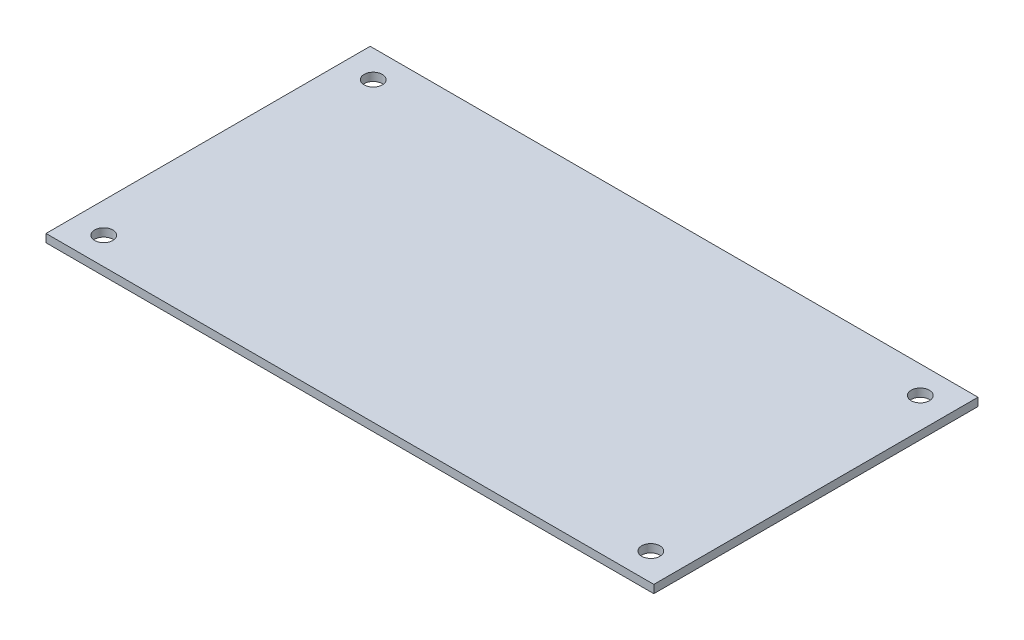
ISO-10303-21;
HEADER;
FILE_DESCRIPTION(('STEP AP214'),'2;1');
FILE_NAME('part.step','',(''),(''),'','','');
FILE_SCHEMA(('AUTOMOTIVE_DESIGN { 1 0 10303 214 1 1 1 1 }'));
ENDSEC;
DATA;
#1=APPLICATION_CONTEXT('core data for automotive mechanical design processes');
#2=APPLICATION_PROTOCOL_DEFINITION('international standard','automotive_design',2000,#1);
#3=PRODUCT_CONTEXT('',#1,'mechanical');
#4=PRODUCT('Part','Part','',(#3));
#5=PRODUCT_RELATED_PRODUCT_CATEGORY('part','',(#4));
#6=PRODUCT_DEFINITION_FORMATION('','',#4);
#7=PRODUCT_DEFINITION_CONTEXT('part definition',#1,'design');
#8=PRODUCT_DEFINITION('design','',#6,#7);
#9=PRODUCT_DEFINITION_SHAPE('','',#8);
#10=(LENGTH_UNIT() NAMED_UNIT(*) SI_UNIT(.MILLI.,.METRE.));
#11=(NAMED_UNIT(*) PLANE_ANGLE_UNIT() SI_UNIT($,.RADIAN.));
#12=(NAMED_UNIT(*) SI_UNIT($,.STERADIAN.) SOLID_ANGLE_UNIT());
#13=UNCERTAINTY_MEASURE_WITH_UNIT(LENGTH_MEASURE(1.E-05),#10,'distance_accuracy_value','');
#14=(GEOMETRIC_REPRESENTATION_CONTEXT(3) GLOBAL_UNCERTAINTY_ASSIGNED_CONTEXT((#13)) GLOBAL_UNIT_ASSIGNED_CONTEXT((#10,
#11,#12)) REPRESENTATION_CONTEXT('',''));
#15=CARTESIAN_POINT('',(0.,0.,0.));
#16=DIRECTION('',(0.,0.,1.));
#17=DIRECTION('',(1.,0.,0.));
#18=AXIS2_PLACEMENT_3D('',#15,#16,#17);
#19=CARTESIAN_POINT('',(0.,4.,-160.));
#20=DIRECTION('',(1.,0.,0.));
#21=DIRECTION('',(0.,0.,-1.));
#22=AXIS2_PLACEMENT_3D('',#19,#20,#21);
#23=PLANE('',#22);
#24=DIRECTION('',(0.,0.,1.));
#25=VECTOR('',#24,1.);
#26=CARTESIAN_POINT('',(0.,0.,-160.));
#27=LINE('',#26,#25);
#28=CARTESIAN_POINT('',(0.,0.,-160.));
#29=VERTEX_POINT('',#28);
#30=CARTESIAN_POINT('',(0.,0.,0.));
#31=VERTEX_POINT('',#30);
#32=EDGE_CURVE('E103',#29,#31,#27,.T.);
#33=ORIENTED_EDGE('',*,*,#32,.T.);
#34=DIRECTION('',(0.,-1.,0.));
#35=VECTOR('',#34,1.);
#36=CARTESIAN_POINT('',(0.,4.,0.));
#37=LINE('',#36,#35);
#38=CARTESIAN_POINT('',(0.,4.,0.));
#39=VERTEX_POINT('',#38);
#40=EDGE_CURVE('E12',#39,#31,#37,.T.);
#41=ORIENTED_EDGE('',*,*,#40,.F.);
#42=DIRECTION('',(0.,0.,1.));
#43=VECTOR('',#42,1.);
#44=CARTESIAN_POINT('',(0.,4.,-160.));
#45=LINE('',#44,#43);
#46=CARTESIAN_POINT('',(0.,4.,-160.));
#47=VERTEX_POINT('',#46);
#48=EDGE_CURVE('E91',#47,#39,#45,.T.);
#49=ORIENTED_EDGE('',*,*,#48,.F.);
#50=DIRECTION('',(0.,-1.,0.));
#51=VECTOR('',#50,1.);
#52=CARTESIAN_POINT('',(0.,4.,-160.));
#53=LINE('',#52,#51);
#54=EDGE_CURVE('E99',#47,#29,#53,.T.);
#55=ORIENTED_EDGE('',*,*,#54,.T.);
#56=EDGE_LOOP('',(#33,#41,#49,#55));
#57=FACE_BOUND('',#56,.T.);
#58=ADVANCED_FACE('F40',(#57),#23,.F.);
#59=CARTESIAN_POINT('',(0.,4.,0.));
#60=DIRECTION('',(0.,0.,-1.));
#61=DIRECTION('',(-1.,0.,0.));
#62=AXIS2_PLACEMENT_3D('',#59,#60,#61);
#63=PLANE('',#62);
#64=DIRECTION('',(1.,0.,0.));
#65=VECTOR('',#64,1.);
#66=CARTESIAN_POINT('',(0.,0.,0.));
#67=LINE('',#66,#65);
#68=CARTESIAN_POINT('',(300.,0.,0.));
#69=VERTEX_POINT('',#68);
#70=EDGE_CURVE('E95',#31,#69,#67,.T.);
#71=ORIENTED_EDGE('',*,*,#70,.T.);
#72=DIRECTION('',(0.,-1.,0.));
#73=VECTOR('',#72,1.);
#74=CARTESIAN_POINT('',(300.,4.,0.));
#75=LINE('',#74,#73);
#76=CARTESIAN_POINT('',(300.,4.,0.));
#77=VERTEX_POINT('',#76);
#78=EDGE_CURVE('E48',#77,#69,#75,.T.);
#79=ORIENTED_EDGE('',*,*,#78,.F.);
#80=DIRECTION('',(1.,0.,0.));
#81=VECTOR('',#80,1.);
#82=CARTESIAN_POINT('',(0.,4.,0.));
#83=LINE('',#82,#81);
#84=EDGE_CURVE('E86',#39,#77,#83,.T.);
#85=ORIENTED_EDGE('',*,*,#84,.F.);
#86=ORIENTED_EDGE('',*,*,#40,.T.);
#87=EDGE_LOOP('',(#71,#79,#85,#86));
#88=FACE_BOUND('',#87,.T.);
#89=ADVANCED_FACE('F94',(#88),#63,.F.);
#90=CARTESIAN_POINT('',(300.,4.,0.));
#91=DIRECTION('',(-1.,0.,0.));
#92=DIRECTION('',(0.,0.,1.));
#93=AXIS2_PLACEMENT_3D('',#90,#91,#92);
#94=PLANE('',#93);
#95=DIRECTION('',(0.,0.,-1.));
#96=VECTOR('',#95,1.);
#97=CARTESIAN_POINT('',(300.,0.,0.));
#98=LINE('',#97,#96);
#99=CARTESIAN_POINT('',(300.,0.,-160.));
#100=VERTEX_POINT('',#99);
#101=EDGE_CURVE('E73',#69,#100,#98,.T.);
#102=ORIENTED_EDGE('',*,*,#101,.T.);
#103=DIRECTION('',(0.,-1.,0.));
#104=VECTOR('',#103,1.);
#105=CARTESIAN_POINT('',(300.,4.,-160.));
#106=LINE('',#105,#104);
#107=CARTESIAN_POINT('',(300.,4.,-160.));
#108=VERTEX_POINT('',#107);
#109=EDGE_CURVE('E96',#108,#100,#106,.T.);
#110=ORIENTED_EDGE('',*,*,#109,.F.);
#111=DIRECTION('',(0.,0.,-1.));
#112=VECTOR('',#111,1.);
#113=CARTESIAN_POINT('',(300.,4.,0.));
#114=LINE('',#113,#112);
#115=EDGE_CURVE('E89',#77,#108,#114,.T.);
#116=ORIENTED_EDGE('',*,*,#115,.F.);
#117=ORIENTED_EDGE('',*,*,#78,.T.);
#118=EDGE_LOOP('',(#102,#110,#116,#117));
#119=FACE_BOUND('',#118,.T.);
#120=ADVANCED_FACE('F97',(#119),#94,.F.);
#121=CARTESIAN_POINT('',(300.,4.,-160.));
#122=DIRECTION('',(0.,0.,1.));
#123=DIRECTION('',(1.,0.,0.));
#124=AXIS2_PLACEMENT_3D('',#121,#122,#123);
#125=PLANE('',#124);
#126=DIRECTION('',(-1.,0.,0.));
#127=VECTOR('',#126,1.);
#128=CARTESIAN_POINT('',(300.,0.,-160.));
#129=LINE('',#128,#127);
#130=EDGE_CURVE('E79',#100,#29,#129,.T.);
#131=ORIENTED_EDGE('',*,*,#130,.T.);
#132=ORIENTED_EDGE('',*,*,#54,.F.);
#133=DIRECTION('',(-1.,0.,0.));
#134=VECTOR('',#133,1.);
#135=CARTESIAN_POINT('',(300.,4.,-160.));
#136=LINE('',#135,#134);
#137=EDGE_CURVE('E56',#108,#47,#136,.T.);
#138=ORIENTED_EDGE('',*,*,#137,.F.);
#139=ORIENTED_EDGE('',*,*,#109,.T.);
#140=EDGE_LOOP('',(#131,#132,#138,#139));
#141=FACE_BOUND('',#140,.T.);
#142=ADVANCED_FACE('F111',(#141),#125,.F.);
#143=CARTESIAN_POINT('',(0.,4.,0.));
#144=DIRECTION('',(0.,1.,0.));
#145=DIRECTION('',(0.,0.,1.));
#146=AXIS2_PLACEMENT_3D('',#143,#144,#145);
#147=PLANE('',#146);
#148=CARTESIAN_POINT('',(15.,4.,-13.5));
#149=DIRECTION('',(0.,1.,0.));
#150=DIRECTION('',(0.,0.,1.));
#151=AXIS2_PLACEMENT_3D('',#148,#149,#150);
#152=CIRCLE('',#151,4.5);
#153=CARTESIAN_POINT('',(15.,4.,-8.99999999999998));
#154=VERTEX_POINT('',#153);
#155=EDGE_CURVE('E126',#154,#154,#152,.T.);
#156=ORIENTED_EDGE('',*,*,#155,.F.);
#157=EDGE_LOOP('',(#156));
#158=FACE_BOUND('',#157,.T.);
#159=CARTESIAN_POINT('',(285.,4.,-13.5));
#160=DIRECTION('',(0.,1.,0.));
#161=DIRECTION('',(0.,0.,1.));
#162=AXIS2_PLACEMENT_3D('',#159,#160,#161);
#163=CIRCLE('',#162,4.50000000000002);
#164=CARTESIAN_POINT('',(285.,4.,-8.99999999999997));
#165=VERTEX_POINT('',#164);
#166=EDGE_CURVE('E132',#165,#165,#163,.T.);
#167=ORIENTED_EDGE('',*,*,#166,.F.);
#168=EDGE_LOOP('',(#167));
#169=FACE_BOUND('',#168,.T.);
#170=CARTESIAN_POINT('',(285.,4.,-146.5));
#171=DIRECTION('',(0.,1.,0.));
#172=DIRECTION('',(0.,0.,1.));
#173=AXIS2_PLACEMENT_3D('',#170,#171,#172);
#174=CIRCLE('',#173,4.50000000000002);
#175=CARTESIAN_POINT('',(285.,4.,-142.));
#176=VERTEX_POINT('',#175);
#177=EDGE_CURVE('E120',#176,#176,#174,.T.);
#178=ORIENTED_EDGE('',*,*,#177,.F.);
#179=EDGE_LOOP('',(#178));
#180=FACE_BOUND('',#179,.T.);
#181=CARTESIAN_POINT('',(15.,4.,-146.5));
#182=DIRECTION('',(0.,1.,0.));
#183=DIRECTION('',(0.,0.,1.));
#184=AXIS2_PLACEMENT_3D('',#181,#182,#183);
#185=CIRCLE('',#184,4.5);
#186=CARTESIAN_POINT('',(15.,4.,-142.));
#187=VERTEX_POINT('',#186);
#188=EDGE_CURVE('E117',#187,#187,#185,.T.);
#189=ORIENTED_EDGE('',*,*,#188,.F.);
#190=EDGE_LOOP('',(#189));
#191=FACE_BOUND('',#190,.T.);
#192=ORIENTED_EDGE('',*,*,#48,.T.);
#193=ORIENTED_EDGE('',*,*,#84,.T.);
#194=ORIENTED_EDGE('',*,*,#115,.T.);
#195=ORIENTED_EDGE('',*,*,#137,.T.);
#196=EDGE_LOOP('',(#192,#193,#194,#195));
#197=FACE_BOUND('',#196,.T.);
#198=ADVANCED_FACE('F87',(#158,#169,#180,#191,#197),#147,.T.);
#199=CARTESIAN_POINT('',(0.,0.,0.));
#200=DIRECTION('',(0.,1.,0.));
#201=DIRECTION('',(0.,0.,1.));
#202=AXIS2_PLACEMENT_3D('',#199,#200,#201);
#203=PLANE('',#202);
#204=CARTESIAN_POINT('',(15.,0.,-13.5));
#205=DIRECTION('',(0.,1.,0.));
#206=DIRECTION('',(0.,0.,1.));
#207=AXIS2_PLACEMENT_3D('',#204,#205,#206);
#208=CIRCLE('',#207,4.5);
#209=CARTESIAN_POINT('',(15.,0.,-8.99999999999998));
#210=VERTEX_POINT('',#209);
#211=EDGE_CURVE('E123',#210,#210,#208,.T.);
#212=ORIENTED_EDGE('',*,*,#211,.T.);
#213=EDGE_LOOP('',(#212));
#214=FACE_BOUND('',#213,.T.);
#215=CARTESIAN_POINT('',(285.,0.,-13.5));
#216=DIRECTION('',(0.,1.,0.));
#217=DIRECTION('',(0.,0.,1.));
#218=AXIS2_PLACEMENT_3D('',#215,#216,#217);
#219=CIRCLE('',#218,4.50000000000002);
#220=CARTESIAN_POINT('',(285.,0.,-8.99999999999997));
#221=VERTEX_POINT('',#220);
#222=EDGE_CURVE('E129',#221,#221,#219,.T.);
#223=ORIENTED_EDGE('',*,*,#222,.T.);
#224=EDGE_LOOP('',(#223));
#225=FACE_BOUND('',#224,.T.);
#226=CARTESIAN_POINT('',(285.,0.,-146.5));
#227=DIRECTION('',(0.,1.,0.));
#228=DIRECTION('',(0.,0.,1.));
#229=AXIS2_PLACEMENT_3D('',#226,#227,#228);
#230=CIRCLE('',#229,4.50000000000002);
#231=CARTESIAN_POINT('',(285.,0.,-142.));
#232=VERTEX_POINT('',#231);
#233=EDGE_CURVE('E135',#232,#232,#230,.T.);
#234=ORIENTED_EDGE('',*,*,#233,.T.);
#235=EDGE_LOOP('',(#234));
#236=FACE_BOUND('',#235,.T.);
#237=CARTESIAN_POINT('',(15.,0.,-146.5));
#238=DIRECTION('',(0.,1.,0.));
#239=DIRECTION('',(0.,0.,1.));
#240=AXIS2_PLACEMENT_3D('',#237,#238,#239);
#241=CIRCLE('',#240,4.5);
#242=CARTESIAN_POINT('',(15.,0.,-142.));
#243=VERTEX_POINT('',#242);
#244=EDGE_CURVE('E106',#243,#243,#241,.T.);
#245=ORIENTED_EDGE('',*,*,#244,.T.);
#246=EDGE_LOOP('',(#245));
#247=FACE_BOUND('',#246,.T.);
#248=ORIENTED_EDGE('',*,*,#32,.F.);
#249=ORIENTED_EDGE('',*,*,#130,.F.);
#250=ORIENTED_EDGE('',*,*,#101,.F.);
#251=ORIENTED_EDGE('',*,*,#70,.F.);
#252=EDGE_LOOP('',(#248,#249,#250,#251));
#253=FACE_BOUND('',#252,.T.);
#254=ADVANCED_FACE('F114',(#214,#225,#236,#247,#253),#203,.F.);
#255=CARTESIAN_POINT('',(15.,0.,-146.5));
#256=DIRECTION('',(0.,1.,0.));
#257=DIRECTION('',(0.,0.,1.));
#258=AXIS2_PLACEMENT_3D('',#255,#256,#257);
#259=CYLINDRICAL_SURFACE('',#258,4.5);
#260=ORIENTED_EDGE('',*,*,#244,.F.);
#261=EDGE_LOOP('',(#260));
#262=FACE_BOUND('',#261,.T.);
#263=ORIENTED_EDGE('',*,*,#188,.T.);
#264=EDGE_LOOP('',(#263));
#265=FACE_BOUND('',#264,.T.);
#266=ADVANCED_FACE('F149',(#262,#265),#259,.F.);
#267=CARTESIAN_POINT('',(285.,0.,-146.5));
#268=DIRECTION('',(0.,1.,0.));
#269=DIRECTION('',(0.,0.,1.));
#270=AXIS2_PLACEMENT_3D('',#267,#268,#269);
#271=CYLINDRICAL_SURFACE('',#270,4.50000000000002);
#272=ORIENTED_EDGE('',*,*,#233,.F.);
#273=EDGE_LOOP('',(#272));
#274=FACE_BOUND('',#273,.T.);
#275=ORIENTED_EDGE('',*,*,#177,.T.);
#276=EDGE_LOOP('',(#275));
#277=FACE_BOUND('',#276,.T.);
#278=ADVANCED_FACE('F141',(#274,#277),#271,.F.);
#279=CARTESIAN_POINT('',(285.,0.,-13.5));
#280=DIRECTION('',(0.,1.,0.));
#281=DIRECTION('',(0.,0.,1.));
#282=AXIS2_PLACEMENT_3D('',#279,#280,#281);
#283=CYLINDRICAL_SURFACE('',#282,4.50000000000002);
#284=ORIENTED_EDGE('',*,*,#222,.F.);
#285=EDGE_LOOP('',(#284));
#286=FACE_BOUND('',#285,.T.);
#287=ORIENTED_EDGE('',*,*,#166,.T.);
#288=EDGE_LOOP('',(#287));
#289=FACE_BOUND('',#288,.T.);
#290=ADVANCED_FACE('F157',(#286,#289),#283,.F.);
#291=CARTESIAN_POINT('',(15.,0.,-13.5));
#292=DIRECTION('',(0.,1.,0.));
#293=DIRECTION('',(0.,0.,1.));
#294=AXIS2_PLACEMENT_3D('',#291,#292,#293);
#295=CYLINDRICAL_SURFACE('',#294,4.5);
#296=ORIENTED_EDGE('',*,*,#211,.F.);
#297=EDGE_LOOP('',(#296));
#298=FACE_BOUND('',#297,.T.);
#299=ORIENTED_EDGE('',*,*,#155,.T.);
#300=EDGE_LOOP('',(#299));
#301=FACE_BOUND('',#300,.T.);
#302=ADVANCED_FACE('F205',(#298,#301),#295,.F.);
#303=CLOSED_SHELL('',(#58,#89,#120,#142,#198,#254,#266,#278,#290,#302));
#304=MANIFOLD_SOLID_BREP('B2',#303);
#305=ADVANCED_BREP_SHAPE_REPRESENTATION('',(#18,#304),#14);
#306=SHAPE_DEFINITION_REPRESENTATION(#9,#305);
ENDSEC;
END-ISO-10303-21;
